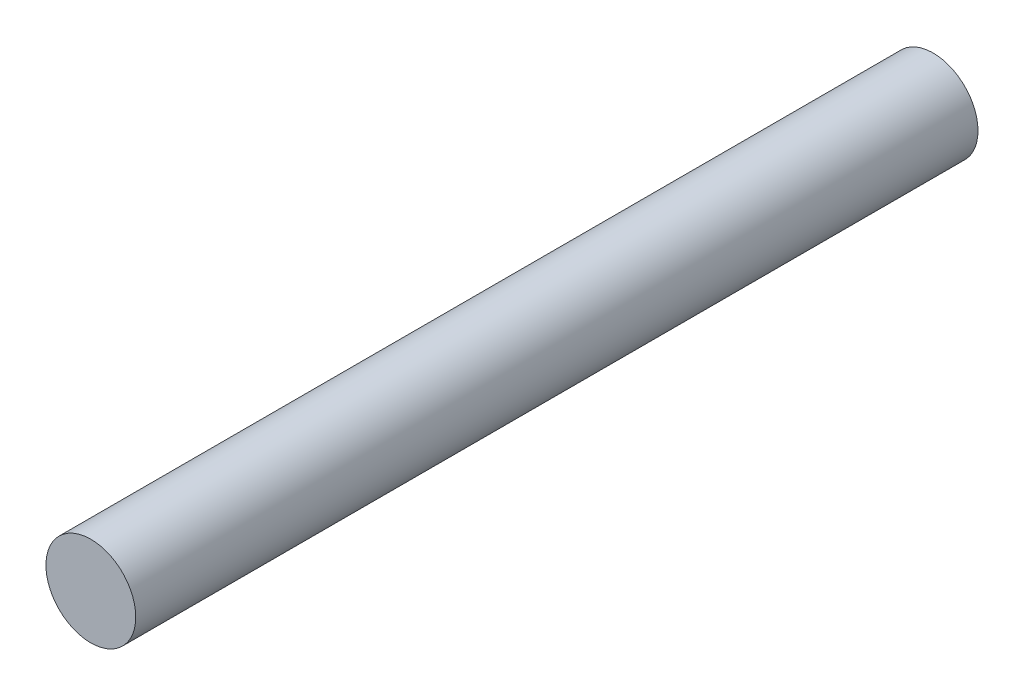
ISO-10303-21;
HEADER;
FILE_DESCRIPTION(('STEP AP214'),'2;1');
FILE_NAME('part.step','',(''),(''),'','','');
FILE_SCHEMA(('AUTOMOTIVE_DESIGN { 1 0 10303 214 1 1 1 1 }'));
ENDSEC;
DATA;
#1=APPLICATION_CONTEXT('core data for automotive mechanical design processes');
#2=APPLICATION_PROTOCOL_DEFINITION('international standard','automotive_design',2000,#1);
#3=PRODUCT_CONTEXT('',#1,'mechanical');
#4=PRODUCT('Part','Part','',(#3));
#5=PRODUCT_RELATED_PRODUCT_CATEGORY('part','',(#4));
#6=PRODUCT_DEFINITION_FORMATION('','',#4);
#7=PRODUCT_DEFINITION_CONTEXT('part definition',#1,'design');
#8=PRODUCT_DEFINITION('design','',#6,#7);
#9=PRODUCT_DEFINITION_SHAPE('','',#8);
#10=(LENGTH_UNIT() NAMED_UNIT(*) SI_UNIT(.MILLI.,.METRE.));
#11=(NAMED_UNIT(*) PLANE_ANGLE_UNIT() SI_UNIT($,.RADIAN.));
#12=(NAMED_UNIT(*) SI_UNIT($,.STERADIAN.) SOLID_ANGLE_UNIT());
#13=UNCERTAINTY_MEASURE_WITH_UNIT(LENGTH_MEASURE(1.E-05),#10,'distance_accuracy_value','');
#14=(GEOMETRIC_REPRESENTATION_CONTEXT(3) GLOBAL_UNCERTAINTY_ASSIGNED_CONTEXT((#13)) GLOBAL_UNIT_ASSIGNED_CONTEXT((#10,
#11,#12)) REPRESENTATION_CONTEXT('',''));
#15=CARTESIAN_POINT('',(0.,0.,0.));
#16=DIRECTION('',(0.,0.,1.));
#17=DIRECTION('',(1.,0.,0.));
#18=AXIS2_PLACEMENT_3D('',#15,#16,#17);
#19=CARTESIAN_POINT('',(0.,0.,150.));
#20=DIRECTION('',(0.,0.,-1.));
#21=DIRECTION('',(-1.,0.,0.));
#22=AXIS2_PLACEMENT_3D('',#19,#20,#21);
#23=CYLINDRICAL_SURFACE('',#22,8.);
#24=CARTESIAN_POINT('',(0.,0.,150.));
#25=DIRECTION('',(0.,0.,1.));
#26=DIRECTION('',(1.,0.,0.));
#27=AXIS2_PLACEMENT_3D('',#24,#25,#26);
#28=CIRCLE('',#27,8.);
#29=CARTESIAN_POINT('',(8.,0.,150.));
#30=VERTEX_POINT('',#29);
#31=EDGE_CURVE('E10',#30,#30,#28,.T.);
#32=ORIENTED_EDGE('',*,*,#31,.F.);
#33=EDGE_LOOP('',(#32));
#34=FACE_BOUND('',#33,.T.);
#35=CARTESIAN_POINT('',(0.,0.,0.));
#36=DIRECTION('',(0.,0.,1.));
#37=DIRECTION('',(1.,0.,0.));
#38=AXIS2_PLACEMENT_3D('',#35,#36,#37);
#39=CIRCLE('',#38,8.);
#40=CARTESIAN_POINT('',(8.,0.,0.));
#41=VERTEX_POINT('',#40);
#42=EDGE_CURVE('E37',#41,#41,#39,.T.);
#43=ORIENTED_EDGE('',*,*,#42,.T.);
#44=EDGE_LOOP('',(#43));
#45=FACE_BOUND('',#44,.T.);
#46=ADVANCED_FACE('F34',(#34,#45),#23,.T.);
#47=CARTESIAN_POINT('',(0.,0.,150.));
#48=DIRECTION('',(0.,0.,1.));
#49=DIRECTION('',(1.,0.,0.));
#50=AXIS2_PLACEMENT_3D('',#47,#48,#49);
#51=PLANE('',#50);
#52=ORIENTED_EDGE('',*,*,#31,.T.);
#53=EDGE_LOOP('',(#52));
#54=FACE_BOUND('',#53,.T.);
#55=ADVANCED_FACE('F50',(#54),#51,.T.);
#56=CARTESIAN_POINT('',(0.,0.,0.));
#57=DIRECTION('',(0.,0.,1.));
#58=DIRECTION('',(1.,0.,0.));
#59=AXIS2_PLACEMENT_3D('',#56,#57,#58);
#60=PLANE('',#59);
#61=ORIENTED_EDGE('',*,*,#42,.F.);
#62=EDGE_LOOP('',(#61));
#63=FACE_BOUND('',#62,.T.);
#64=ADVANCED_FACE('F48',(#63),#60,.F.);
#65=CLOSED_SHELL('',(#46,#55,#64));
#66=MANIFOLD_SOLID_BREP('B2',#65);
#67=ADVANCED_BREP_SHAPE_REPRESENTATION('',(#18,#66),#14);
#68=SHAPE_DEFINITION_REPRESENTATION(#9,#67);
ENDSEC;
END-ISO-10303-21;
